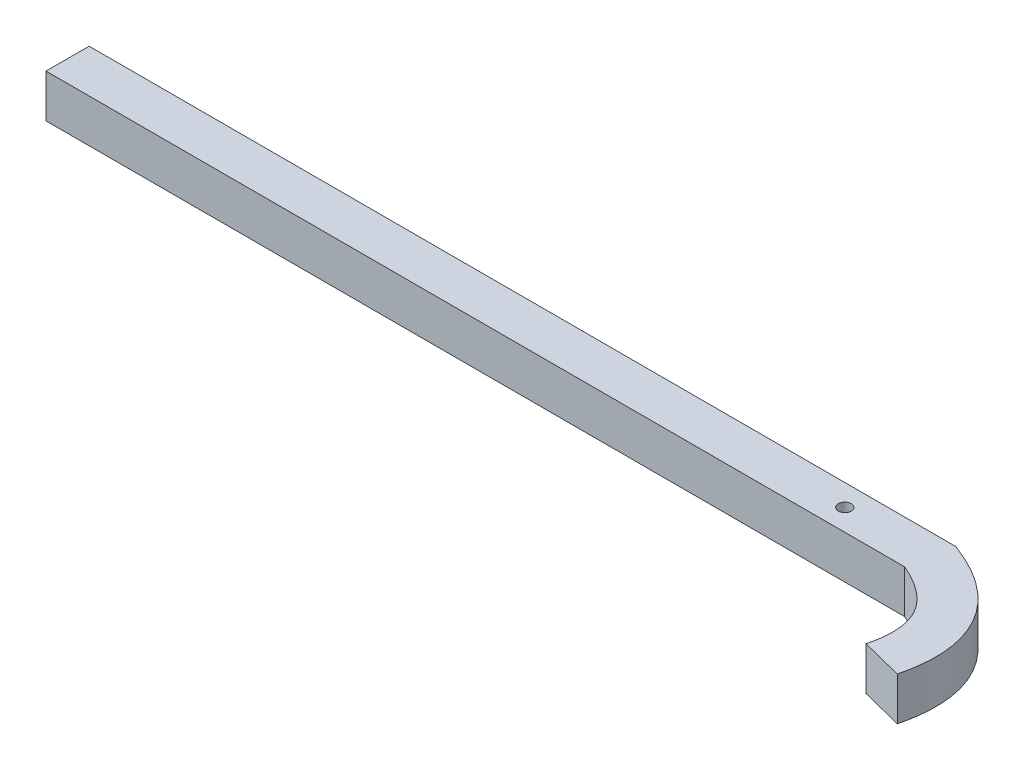
ISO-10303-21;
HEADER;
FILE_DESCRIPTION(('STEP AP214'),'2;1');
FILE_NAME('part.step','',(''),(''),'','','');
FILE_SCHEMA(('AUTOMOTIVE_DESIGN { 1 0 10303 214 1 1 1 1 }'));
ENDSEC;
DATA;
#1=APPLICATION_CONTEXT('core data for automotive mechanical design processes');
#2=APPLICATION_PROTOCOL_DEFINITION('international standard','automotive_design',2000,#1);
#3=PRODUCT_CONTEXT('',#1,'mechanical');
#4=PRODUCT('Part','Part','',(#3));
#5=PRODUCT_RELATED_PRODUCT_CATEGORY('part','',(#4));
#6=PRODUCT_DEFINITION_FORMATION('','',#4);
#7=PRODUCT_DEFINITION_CONTEXT('part definition',#1,'design');
#8=PRODUCT_DEFINITION('design','',#6,#7);
#9=PRODUCT_DEFINITION_SHAPE('','',#8);
#10=(LENGTH_UNIT() NAMED_UNIT(*) SI_UNIT(.MILLI.,.METRE.));
#11=(NAMED_UNIT(*) PLANE_ANGLE_UNIT() SI_UNIT($,.RADIAN.));
#12=(NAMED_UNIT(*) SI_UNIT($,.STERADIAN.) SOLID_ANGLE_UNIT());
#13=UNCERTAINTY_MEASURE_WITH_UNIT(LENGTH_MEASURE(1.E-05),#10,'distance_accuracy_value','');
#14=(GEOMETRIC_REPRESENTATION_CONTEXT(3) GLOBAL_UNCERTAINTY_ASSIGNED_CONTEXT((#13)) GLOBAL_UNIT_ASSIGNED_CONTEXT((#10,
#11,#12)) REPRESENTATION_CONTEXT('',''));
#15=CARTESIAN_POINT('',(0.,0.,0.));
#16=DIRECTION('',(0.,0.,1.));
#17=DIRECTION('',(1.,0.,0.));
#18=AXIS2_PLACEMENT_3D('',#15,#16,#17);
#19=CARTESIAN_POINT('',(177.902591858149,10.,-10.));
#20=DIRECTION('',(0.,-1.,0.));
#21=DIRECTION('',(0.,0.,-1.));
#22=AXIS2_PLACEMENT_3D('',#19,#20,#21);
#23=PLANE('',#22);
#24=CARTESIAN_POINT('',(110.,10.,0.));
#25=DIRECTION('',(0.,1.,0.));
#26=DIRECTION('',(0.,0.,1.));
#27=AXIS2_PLACEMENT_3D('',#24,#25,#26);
#28=CIRCLE('',#27,3.00000000000001);
#29=CARTESIAN_POINT('',(110.,10.,3.00000000000001));
#30=VERTEX_POINT('',#29);
#31=EDGE_CURVE('E144',#30,#30,#28,.T.);
#32=ORIENTED_EDGE('',*,*,#31,.F.);
#33=EDGE_LOOP('',(#32));
#34=FACE_BOUND('',#33,.T.);
#35=DIRECTION('',(-1.,0.,0.));
#36=VECTOR('',#35,1.);
#37=CARTESIAN_POINT('',(177.902591858149,10.,10.));
#38=LINE('',#37,#36);
#39=CARTESIAN_POINT('',(147.713708848856,10.,10.));
#40=VERTEX_POINT('',#39);
#41=CARTESIAN_POINT('',(-250.381679389313,10.,10.));
#42=VERTEX_POINT('',#41);
#43=EDGE_CURVE('E210',#40,#42,#38,.T.);
#44=ORIENTED_EDGE('',*,*,#43,.F.);
#45=CARTESIAN_POINT('',(147.713708848856,10.,9.99999999999999));
#46=CARTESIAN_POINT('',(150.081363110265,10.,10.9358404741904));
#47=CARTESIAN_POINT('',(154.528980952823,10.,13.1788147449034));
#48=CARTESIAN_POINT('',(160.089294206417,10.,16.7889735365902));
#49=CARTESIAN_POINT('',(164.357345810155,10.,20.6459259482876));
#50=CARTESIAN_POINT('',(167.432438964962,10.,24.6123384166422));
#51=CARTESIAN_POINT('',(169.508960938775,10.,28.7079400858626));
#52=CARTESIAN_POINT('',(170.78049703697,10.,33.0844068776301));
#53=CARTESIAN_POINT('',(171.308914135224,10.,37.9957200930307));
#54=CARTESIAN_POINT('',(171.02871454986,10.,43.5843950988019));
#55=CARTESIAN_POINT('',(170.221323046046,10.,47.7546976190972));
#56=CARTESIAN_POINT('',(169.694372092045,10.,49.8389294134533));
#57=B_SPLINE_CURVE_WITH_KNOTS('',3,(#45,#46,#47,#48,#49,#50,#51,#52,#53,#54,#55,#56),
.UNSPECIFIED.,.F.,.F.,(4,1,1,1,1,1,1,1,1,4),(0.,0.132599857350981,0.253471230054705,
0.364788666069843,0.469300478006779,0.570281662936163,0.669514853226326,0.772223870651777,
0.881514942063959,1.),.UNSPECIFIED.);
#58=CARTESIAN_POINT('',(169.694372092045,10.,49.8389294134533));
#59=VERTEX_POINT('',#58);
#60=EDGE_CURVE('E177',#40,#59,#57,.T.);
#61=ORIENTED_EDGE('',*,*,#60,.T.);
#62=DIRECTION('',(-0.969494088505385,0.,-0.245114692242454));
#63=VECTOR('',#62,1.);
#64=CARTESIAN_POINT('',(179.389312977099,10.,52.2900763358779));
#65=LINE('',#64,#63);
#66=CARTESIAN_POINT('',(189.084253862153,10.,54.7412232583024));
#67=VERTEX_POINT('',#66);
#68=EDGE_CURVE('E185',#67,#59,#65,.T.);
#69=ORIENTED_EDGE('',*,*,#68,.F.);
#70=CARTESIAN_POINT('',(151.522932372518,10.,-10.));
#71=CARTESIAN_POINT('',(154.712223150804,10.,-8.73939897267547));
#72=CARTESIAN_POINT('',(160.708606990489,10.,-6.27013356306773));
#73=CARTESIAN_POINT('',(169.189391199744,10.,-1.35745716318533));
#74=CARTESIAN_POINT('',(176.563581045502,9.99999999999999,4.44084880327522));
#75=CARTESIAN_POINT('',(182.693323150686,9.99999999999999,11.2788765251708));
#76=CARTESIAN_POINT('',(187.299514853687,10.,19.0654259630927));
#77=CARTESIAN_POINT('',(190.201744816442,10.,27.5790198884068));
#78=CARTESIAN_POINT('',(191.39483682233,10.,36.5084467679523));
#79=CARTESIAN_POINT('',(190.998421352275,10.,45.7445437476372));
#80=CARTESIAN_POINT('',(189.861567362946,10.,51.666740708767));
#81=CARTESIAN_POINT('',(189.084253862153,10.,54.7412232583024));
#82=B_SPLINE_CURVE_WITH_KNOTS('',3,(#70,#71,#72,#73,#74,#75,#76,#77,#78,#79,#80,#81),
.UNSPECIFIED.,.F.,.F.,(4,1,1,1,1,1,1,1,1,4),(0.,0.132599857350981,0.253471230054705,
0.364788666069843,0.469300478006779,0.570281662936163,0.669514853226326,0.772223870651777,
0.881514942063959,1.),.UNSPECIFIED.);
#83=CARTESIAN_POINT('',(151.522932372518,10.,-10.));
#84=VERTEX_POINT('',#83);
#85=EDGE_CURVE('E154',#84,#67,#82,.T.);
#86=ORIENTED_EDGE('',*,*,#85,.F.);
#87=DIRECTION('',(-1.,0.,0.));
#88=VECTOR('',#87,1.);
#89=CARTESIAN_POINT('',(177.902591858149,10.,-10.));
#90=LINE('',#89,#88);
#91=CARTESIAN_POINT('',(-250.381679389313,10.,-10.));
#92=VERTEX_POINT('',#91);
#93=EDGE_CURVE('E212',#84,#92,#90,.T.);
#94=ORIENTED_EDGE('',*,*,#93,.T.);
#95=DIRECTION('',(0.,0.,1.));
#96=VECTOR('',#95,1.);
#97=CARTESIAN_POINT('',(-250.381679389313,10.,-10.));
#98=LINE('',#97,#96);
#99=EDGE_CURVE('E207',#92,#42,#98,.T.);
#100=ORIENTED_EDGE('',*,*,#99,.T.);
#101=EDGE_LOOP('',(#44,#61,#69,#86,#94,#100));
#102=FACE_BOUND('',#101,.T.);
#103=ADVANCED_FACE('F33',(#34,#102),#23,.F.);
#104=CARTESIAN_POINT('',(177.902591858149,10.,-10.));
#105=DIRECTION('',(0.,0.,1.));
#106=DIRECTION('',(1.,0.,0.));
#107=AXIS2_PLACEMENT_3D('',#104,#105,#106);
#108=PLANE('',#107);
#109=DIRECTION('',(1.,0.,0.));
#110=VECTOR('',#109,1.);
#111=CARTESIAN_POINT('',(0.,4.25,-10.));
#112=LINE('',#111,#110);
#113=CARTESIAN_POINT('',(-245.420808417911,4.25,-10.));
#114=VERTEX_POINT('',#113);
#115=CARTESIAN_POINT('',(0.,4.25,-10.));
#116=VERTEX_POINT('',#115);
#117=EDGE_CURVE('E138',#114,#116,#112,.T.);
#118=ORIENTED_EDGE('',*,*,#117,.F.);
#119=DIRECTION('',(0.,1.,0.));
#120=VECTOR('',#119,1.);
#121=CARTESIAN_POINT('',(-245.420808417911,4.25,-10.));
#122=LINE('',#121,#120);
#123=CARTESIAN_POINT('',(-245.420808417911,-4.25,-10.));
#124=VERTEX_POINT('',#123);
#125=EDGE_CURVE('E48',#124,#114,#122,.T.);
#126=ORIENTED_EDGE('',*,*,#125,.F.);
#127=DIRECTION('',(-1.,0.,0.));
#128=VECTOR('',#127,1.);
#129=CARTESIAN_POINT('',(0.,-4.25,-10.));
#130=LINE('',#129,#128);
#131=CARTESIAN_POINT('',(0.,-4.25,-10.));
#132=VERTEX_POINT('',#131);
#133=EDGE_CURVE('E129',#132,#124,#130,.T.);
#134=ORIENTED_EDGE('',*,*,#133,.F.);
#135=DIRECTION('',(0.,-1.,0.));
#136=VECTOR('',#135,1.);
#137=CARTESIAN_POINT('',(0.,4.25,-10.));
#138=LINE('',#137,#136);
#139=EDGE_CURVE('E132',#116,#132,#138,.T.);
#140=ORIENTED_EDGE('',*,*,#139,.F.);
#141=EDGE_LOOP('',(#118,#126,#134,#140));
#142=FACE_BOUND('',#141,.T.);
#143=DIRECTION('',(0.,1.,0.));
#144=VECTOR('',#143,1.);
#145=CARTESIAN_POINT('',(151.522932372518,10.,-10.));
#146=LINE('',#145,#144);
#147=CARTESIAN_POINT('',(151.522932372518,-10.,-10.));
#148=VERTEX_POINT('',#147);
#149=EDGE_CURVE('E41',#148,#84,#146,.T.);
#150=ORIENTED_EDGE('',*,*,#149,.F.);
#151=DIRECTION('',(-1.,0.,0.));
#152=VECTOR('',#151,1.);
#153=CARTESIAN_POINT('',(177.902591858149,-10.,-10.));
#154=LINE('',#153,#152);
#155=CARTESIAN_POINT('',(-250.381679389313,-10.,-10.));
#156=VERTEX_POINT('',#155);
#157=EDGE_CURVE('E214',#148,#156,#154,.T.);
#158=ORIENTED_EDGE('',*,*,#157,.T.);
#159=DIRECTION('',(0.,1.,0.));
#160=VECTOR('',#159,1.);
#161=CARTESIAN_POINT('',(-250.381679389313,10.,-10.));
#162=LINE('',#161,#160);
#163=EDGE_CURVE('E204',#156,#92,#162,.T.);
#164=ORIENTED_EDGE('',*,*,#163,.T.);
#165=ORIENTED_EDGE('',*,*,#93,.F.);
#166=EDGE_LOOP('',(#150,#158,#164,#165));
#167=FACE_BOUND('',#166,.T.);
#168=ADVANCED_FACE('F230',(#142,#167),#108,.F.);
#169=CARTESIAN_POINT('',(177.902591858149,-10.,-10.));
#170=DIRECTION('',(0.,1.,0.));
#171=DIRECTION('',(0.,0.,1.));
#172=AXIS2_PLACEMENT_3D('',#169,#170,#171);
#173=PLANE('',#172);
#174=CARTESIAN_POINT('',(110.,-10.,0.));
#175=DIRECTION('',(0.,1.,0.));
#176=DIRECTION('',(0.,0.,1.));
#177=AXIS2_PLACEMENT_3D('',#174,#175,#176);
#178=CIRCLE('',#177,3.00000000000001);
#179=CARTESIAN_POINT('',(110.,-10.,3.00000000000001));
#180=VERTEX_POINT('',#179);
#181=EDGE_CURVE('E148',#180,#180,#178,.T.);
#182=ORIENTED_EDGE('',*,*,#181,.T.);
#183=EDGE_LOOP('',(#182));
#184=FACE_BOUND('',#183,.T.);
#185=ORIENTED_EDGE('',*,*,#157,.F.);
#186=CARTESIAN_POINT('',(151.522932372518,-9.99999999999999,-9.99999999999999));
#187=CARTESIAN_POINT('',(154.712223150804,-9.99999999999999,-8.73939897267545));
#188=CARTESIAN_POINT('',(160.708606990489,-9.99999999999999,-6.27013356306771));
#189=CARTESIAN_POINT('',(169.189391199744,-9.99999999999999,-1.35745716318532));
#190=CARTESIAN_POINT('',(176.563581045502,-10.,4.44084880327525));
#191=CARTESIAN_POINT('',(182.693323150686,-9.99999999999999,11.2788765251708));
#192=CARTESIAN_POINT('',(187.299514853687,-10.,19.0654259630927));
#193=CARTESIAN_POINT('',(190.201744816442,-10.,27.5790198884068));
#194=CARTESIAN_POINT('',(191.39483682233,-9.99999999999999,36.5084467679523));
#195=CARTESIAN_POINT('',(190.998421352275,-10.,45.7445437476372));
#196=CARTESIAN_POINT('',(189.861567362946,-9.99999999999999,51.666740708767));
#197=CARTESIAN_POINT('',(189.084253862153,-9.99999999999999,54.7412232583024));
#198=B_SPLINE_CURVE_WITH_KNOTS('',3,(#186,#187,#188,#189,#190,#191,#192,#193,#194,#195,#196,
#197),.UNSPECIFIED.,.F.,.F.,(4,1,1,1,1,1,1,1,1,4),(0.,0.132599857350981,0.253471230054705,
0.364788666069843,0.469300478006779,0.570281662936163,0.669514853226326,0.772223870651777,
0.881514942063959,1.),.UNSPECIFIED.);
#199=CARTESIAN_POINT('',(189.084253862153,-9.99999999999999,54.7412232583024));
#200=VERTEX_POINT('',#199);
#201=EDGE_CURVE('E159',#148,#200,#198,.T.);
#202=ORIENTED_EDGE('',*,*,#201,.T.);
#203=DIRECTION('',(0.969494088505385,0.,0.245114692242452));
#204=VECTOR('',#203,1.);
#205=CARTESIAN_POINT('',(179.389312977099,-9.99999999999999,52.2900763358778));
#206=LINE('',#205,#204);
#207=CARTESIAN_POINT('',(169.694372092045,-10.,49.8389294134533));
#208=VERTEX_POINT('',#207);
#209=EDGE_CURVE('E167',#208,#200,#206,.T.);
#210=ORIENTED_EDGE('',*,*,#209,.F.);
#211=CARTESIAN_POINT('',(147.713708848856,-10.,10.));
#212=CARTESIAN_POINT('',(150.081363110265,-10.,10.9358404741904));
#213=CARTESIAN_POINT('',(154.528980952823,-10.,13.1788147449035));
#214=CARTESIAN_POINT('',(160.089294206417,-10.,16.7889735365902));
#215=CARTESIAN_POINT('',(164.357345810155,-9.99999999999999,20.6459259482876));
#216=CARTESIAN_POINT('',(167.432438964962,-9.99999999999999,24.6123384166423));
#217=CARTESIAN_POINT('',(169.508960938775,-10.,28.7079400858626));
#218=CARTESIAN_POINT('',(170.78049703697,-10.,33.0844068776301));
#219=CARTESIAN_POINT('',(171.308914135224,-10.,37.9957200930307));
#220=CARTESIAN_POINT('',(171.02871454986,-10.,43.5843950988018));
#221=CARTESIAN_POINT('',(170.221323046046,-10.,47.7546976190972));
#222=CARTESIAN_POINT('',(169.694372092045,-10.,49.8389294134533));
#223=B_SPLINE_CURVE_WITH_KNOTS('',3,(#211,#212,#213,#214,#215,#216,#217,#218,#219,#220,#221,
#222),.UNSPECIFIED.,.F.,.F.,(4,1,1,1,1,1,1,1,1,4),(0.,0.132599857350981,0.253471230054705,
0.364788666069843,0.469300478006779,0.570281662936163,0.669514853226326,0.772223870651777,
0.881514942063959,1.),.UNSPECIFIED.);
#224=CARTESIAN_POINT('',(147.713708848856,-10.,10.));
#225=VERTEX_POINT('',#224);
#226=EDGE_CURVE('E168',#225,#208,#223,.T.);
#227=ORIENTED_EDGE('',*,*,#226,.F.);
#228=DIRECTION('',(-1.,0.,0.));
#229=VECTOR('',#228,1.);
#230=CARTESIAN_POINT('',(177.902591858149,-10.,10.));
#231=LINE('',#230,#229);
#232=CARTESIAN_POINT('',(-250.381679389313,-10.,10.));
#233=VERTEX_POINT('',#232);
#234=EDGE_CURVE('E198',#225,#233,#231,.T.);
#235=ORIENTED_EDGE('',*,*,#234,.T.);
#236=DIRECTION('',(0.,0.,-1.));
#237=VECTOR('',#236,1.);
#238=CARTESIAN_POINT('',(-250.381679389313,-10.,-10.));
#239=LINE('',#238,#237);
#240=EDGE_CURVE('E201',#233,#156,#239,.T.);
#241=ORIENTED_EDGE('',*,*,#240,.T.);
#242=EDGE_LOOP('',(#185,#202,#210,#227,#235,#241));
#243=FACE_BOUND('',#242,.T.);
#244=ADVANCED_FACE('F218',(#184,#243),#173,.F.);
#245=CARTESIAN_POINT('',(177.902591858149,10.,10.));
#246=DIRECTION('',(0.,0.,-1.));
#247=DIRECTION('',(0.,1.,0.));
#248=AXIS2_PLACEMENT_3D('',#245,#246,#247);
#249=PLANE('',#248);
#250=DIRECTION('',(0.,-1.,0.));
#251=VECTOR('',#250,1.);
#252=CARTESIAN_POINT('',(147.713708848856,10.,10.));
#253=LINE('',#252,#251);
#254=EDGE_CURVE('E11',#40,#225,#253,.T.);
#255=ORIENTED_EDGE('',*,*,#254,.F.);
#256=ORIENTED_EDGE('',*,*,#43,.T.);
#257=DIRECTION('',(0.,-1.,0.));
#258=VECTOR('',#257,1.);
#259=CARTESIAN_POINT('',(-250.381679389313,10.,10.));
#260=LINE('',#259,#258);
#261=EDGE_CURVE('E191',#42,#233,#260,.T.);
#262=ORIENTED_EDGE('',*,*,#261,.T.);
#263=ORIENTED_EDGE('',*,*,#234,.F.);
#264=EDGE_LOOP('',(#255,#256,#262,#263));
#265=FACE_BOUND('',#264,.T.);
#266=ADVANCED_FACE('F35',(#265),#249,.F.);
#267=CARTESIAN_POINT('',(-250.381679389313,0.,0.));
#268=DIRECTION('',(-1.,0.,0.));
#269=DIRECTION('',(0.,0.,1.));
#270=AXIS2_PLACEMENT_3D('',#267,#268,#269);
#271=PLANE('',#270);
#272=ORIENTED_EDGE('',*,*,#261,.F.);
#273=ORIENTED_EDGE('',*,*,#99,.F.);
#274=ORIENTED_EDGE('',*,*,#163,.F.);
#275=ORIENTED_EDGE('',*,*,#240,.F.);
#276=EDGE_LOOP('',(#272,#273,#274,#275));
#277=FACE_BOUND('',#276,.T.);
#278=ADVANCED_FACE('F224',(#277),#271,.T.);
#279=CARTESIAN_POINT('',(179.389312977099,10.,52.2900763358779));
#280=DIRECTION('',(0.245114692242454,0.,-0.969494088505385));
#281=DIRECTION('',(-0.969494088505385,0.,-0.245114692242454));
#282=AXIS2_PLACEMENT_3D('',#279,#280,#281);
#283=PLANE('',#282);
#284=ORIENTED_EDGE('',*,*,#68,.T.);
#285=DIRECTION('',(0.,-1.,0.));
#286=VECTOR('',#285,1.);
#287=CARTESIAN_POINT('',(169.694372092045,0.,49.8389294134533));
#288=LINE('',#287,#286);
#289=EDGE_CURVE('E176',#59,#208,#288,.T.);
#290=ORIENTED_EDGE('',*,*,#289,.T.);
#291=ORIENTED_EDGE('',*,*,#209,.T.);
#292=DIRECTION('',(0.,1.,0.));
#293=VECTOR('',#292,1.);
#294=CARTESIAN_POINT('',(189.084253862153,0.,54.7412232583024));
#295=LINE('',#294,#293);
#296=EDGE_CURVE('E151',#200,#67,#295,.T.);
#297=ORIENTED_EDGE('',*,*,#296,.T.);
#298=EDGE_LOOP('',(#284,#290,#291,#297));
#299=FACE_BOUND('',#298,.T.);
#300=ADVANCED_FACE('F235',(#299),#283,.F.);
#301=CARTESIAN_POINT('',(147.713708848856,10.,9.99999999999999));
#302=CARTESIAN_POINT('',(150.081363110265,10.,10.9358404741904));
#303=CARTESIAN_POINT('',(154.528980952823,10.,13.1788147449034));
#304=CARTESIAN_POINT('',(160.089294206417,10.,16.7889735365902));
#305=CARTESIAN_POINT('',(164.357345810155,10.,20.6459259482876));
#306=CARTESIAN_POINT('',(167.432438964962,10.,24.6123384166422));
#307=CARTESIAN_POINT('',(169.508960938775,10.,28.7079400858626));
#308=CARTESIAN_POINT('',(170.78049703697,10.,33.0844068776301));
#309=CARTESIAN_POINT('',(171.308914135224,10.,37.9957200930307));
#310=CARTESIAN_POINT('',(171.02871454986,10.,43.5843950988019));
#311=CARTESIAN_POINT('',(170.221323046046,10.,47.7546976190972));
#312=CARTESIAN_POINT('',(169.694372092045,10.,49.8389294134533));
#313=CARTESIAN_POINT('',(147.713708848856,3.33333333333333,10.));
#314=CARTESIAN_POINT('',(149.909436979569,3.33333333333333,10.8678848464203));
#315=CARTESIAN_POINT('',(154.601688172113,3.33333333333333,13.2075657940756));
#316=CARTESIAN_POINT('',(160.072193733132,3.33333333333333,16.7821753434263));
#317=CARTESIAN_POINT('',(164.361444153705,3.33333333333335,20.6476752175819));
#318=CARTESIAN_POINT('',(167.431504693336,3.33333333333334,24.6115243787849));
#319=CARTESIAN_POINT('',(169.50886365035,3.33333333333334,28.709491097975));
#320=CARTESIAN_POINT('',(170.781781864086,3.33333333333334,33.0790033440261));
#321=CARTESIAN_POINT('',(171.303519645476,3.33333333333334,38.0171506314902));
#322=CARTESIAN_POINT('',(171.051117307955,3.33333333333334,43.4957561857528));
#323=CARTESIAN_POINT('',(170.168935082442,3.33333333333333,47.9619060102289));
#324=CARTESIAN_POINT('',(169.694372092045,3.33333333333333,49.8389294134533));
#325=CARTESIAN_POINT('',(147.713708848856,-3.33333333333334,10.));
#326=CARTESIAN_POINT('',(149.880612959326,-3.33333333333334,10.8564918465167));
#327=CARTESIAN_POINT('',(154.61387779304,-3.33333333333334,13.2123860085478));
#328=CARTESIAN_POINT('',(160.069326778666,-3.33333333333333,16.7810356024423));
#329=CARTESIAN_POINT('',(164.36213125541,-3.33333333333332,20.6479684887289));
#330=CARTESIAN_POINT('',(167.431348059413,-3.33333333333333,24.6113879024762));
#331=CARTESIAN_POINT('',(169.508847339604,-3.33333333333333,28.7097511306085));
#332=CARTESIAN_POINT('',(170.781997269868,-3.33333333333333,33.0780974226205));
#333=CARTESIAN_POINT('',(171.302615240304,-3.33333333333333,38.0207435366052));
#334=CARTESIAN_POINT('',(171.05487320911,-3.33333333333333,43.4808955603571));
#335=CARTESIAN_POINT('',(170.160152056167,-3.33333333333333,47.9966452254735));
#336=CARTESIAN_POINT('',(169.694372092045,-3.33333333333333,49.8389294134533));
#337=CARTESIAN_POINT('',(147.713708848856,-10.,10.));
#338=CARTESIAN_POINT('',(150.081363110265,-10.,10.9358404741904));
#339=CARTESIAN_POINT('',(154.528980952823,-10.,13.1788147449035));
#340=CARTESIAN_POINT('',(160.089294206417,-10.,16.7889735365902));
#341=CARTESIAN_POINT('',(164.357345810155,-9.99999999999999,20.6459259482876));
#342=CARTESIAN_POINT('',(167.432438964962,-9.99999999999999,24.6123384166423));
#343=CARTESIAN_POINT('',(169.508960938775,-10.,28.7079400858626));
#344=CARTESIAN_POINT('',(170.78049703697,-10.,33.0844068776301));
#345=CARTESIAN_POINT('',(171.308914135224,-10.,37.9957200930307));
#346=CARTESIAN_POINT('',(171.02871454986,-10.,43.5843950988018));
#347=CARTESIAN_POINT('',(170.221323046046,-10.,47.7546976190972));
#348=CARTESIAN_POINT('',(169.694372092045,-10.,49.8389294134533));
#349=B_SPLINE_SURFACE_WITH_KNOTS('',3,3,((#301,#302,#303,#304,#305,#306,#307,#308,#309,#310,
#311,#312),(#313,#314,#315,#316,#317,#318,#319,#320,#321,#322,#323,#324),(#325,#326,#327,#328,
#329,#330,#331,#332,#333,#334,#335,#336),(#337,#338,#339,#340,#341,#342,#343,#344,#345,#346,
#347,#348)),.UNSPECIFIED.,.F.,.F.,.F.,(4,4),(4,1,1,1,1,1,1,1,1,4),(0.252227003351707,0.5),(0.,
0.132599857350981,0.253471230054705,0.364788666069843,0.469300478006779,0.570281662936163,
0.669514853226326,0.772223870651777,0.881514942063959,1.),.UNSPECIFIED.);
#350=ORIENTED_EDGE('',*,*,#254,.T.);
#351=ORIENTED_EDGE('',*,*,#226,.T.);
#352=ORIENTED_EDGE('',*,*,#289,.F.);
#353=ORIENTED_EDGE('',*,*,#60,.F.);
#354=EDGE_LOOP('',(#350,#351,#352,#353));
#355=FACE_BOUND('',#354,.T.);
#356=ADVANCED_FACE('F237',(#355),#349,.T.);
#357=CARTESIAN_POINT('',(151.522932372518,-9.99999999999999,-9.99999999999999));
#358=CARTESIAN_POINT('',(154.712223150804,-9.99999999999999,-8.73939897267545));
#359=CARTESIAN_POINT('',(160.708606990489,-9.99999999999999,-6.27013356306771));
#360=CARTESIAN_POINT('',(169.189391199744,-9.99999999999999,-1.35745716318532));
#361=CARTESIAN_POINT('',(176.563581045502,-10.,4.44084880327525));
#362=CARTESIAN_POINT('',(182.693323150686,-9.99999999999999,11.2788765251708));
#363=CARTESIAN_POINT('',(187.299514853687,-10.,19.0654259630927));
#364=CARTESIAN_POINT('',(190.201744816442,-10.,27.5790198884068));
#365=CARTESIAN_POINT('',(191.39483682233,-9.99999999999999,36.5084467679523));
#366=CARTESIAN_POINT('',(190.998421352275,-10.,45.7445437476372));
#367=CARTESIAN_POINT('',(189.861567362946,-9.99999999999999,51.666740708767));
#368=CARTESIAN_POINT('',(189.084253862153,-9.99999999999999,54.7412232583024));
#369=CARTESIAN_POINT('',(151.522932372518,-3.33333333333333,-9.99999999999999));
#370=CARTESIAN_POINT('',(154.8841492815,-3.33333333333333,-8.67144334490539));
#371=CARTESIAN_POINT('',(160.635899771199,-3.33333333333332,-6.29888461223983));
#372=CARTESIAN_POINT('',(169.20649167303,-3.33333333333333,-1.35065897002141));
#373=CARTESIAN_POINT('',(176.559482701952,-3.33333333333334,4.43909953398096));
#374=CARTESIAN_POINT('',(182.694257422312,-3.33333333333333,11.2796905630282));
#375=CARTESIAN_POINT('',(187.299612142112,-3.33333333333334,19.0638749509803));
#376=CARTESIAN_POINT('',(190.200459989326,-3.33333333333333,27.5844234220108));
#377=CARTESIAN_POINT('',(191.400231312078,-3.33333333333333,36.4870162294928));
#378=CARTESIAN_POINT('',(190.97601859418,-3.33333333333333,45.8331826606862));
#379=CARTESIAN_POINT('',(189.913955326549,-3.33333333333333,51.4595323176352));
#380=CARTESIAN_POINT('',(189.084253862153,-3.33333333333333,54.7412232583024));
#381=CARTESIAN_POINT('',(151.522932372518,3.33333333333334,-9.99999999999999));
#382=CARTESIAN_POINT('',(154.798186216152,3.33333333333334,-8.70542115879042));
#383=CARTESIAN_POINT('',(160.672253380844,3.33333333333334,-6.28450908765377));
#384=CARTESIAN_POINT('',(169.197941436387,3.33333333333334,-1.35405806660337));
#385=CARTESIAN_POINT('',(176.561531873727,3.33333333333333,4.43997416862811));
#386=CARTESIAN_POINT('',(182.693790286499,3.33333333333333,11.2792835440995));
#387=CARTESIAN_POINT('',(187.2995634979,3.33333333333333,19.0646504570365));
#388=CARTESIAN_POINT('',(190.201102402884,3.33333333333333,27.5817216552088));
#389=CARTESIAN_POINT('',(191.397534067204,3.33333333333333,36.4977314987226));
#390=CARTESIAN_POINT('',(190.987219973228,3.33333333333333,45.7888632041617));
#391=CARTESIAN_POINT('',(189.887761344748,3.33333333333334,51.5631365132011));
#392=CARTESIAN_POINT('',(189.084253862153,3.33333333333334,54.7412232583024));
#393=CARTESIAN_POINT('',(151.522932372518,10.,-9.99999999999999));
#394=CARTESIAN_POINT('',(154.712223150804,10.,-8.73939897267545));
#395=CARTESIAN_POINT('',(160.708606990489,10.,-6.27013356306771));
#396=CARTESIAN_POINT('',(169.189391199744,10.,-1.35745716318532));
#397=CARTESIAN_POINT('',(176.563581045502,9.99999999999999,4.44084880327526));
#398=CARTESIAN_POINT('',(182.693323150686,9.99999999999999,11.2788765251708));
#399=CARTESIAN_POINT('',(187.299514853687,10.,19.0654259630927));
#400=CARTESIAN_POINT('',(190.201744816442,10.,27.5790198884068));
#401=CARTESIAN_POINT('',(191.39483682233,10.,36.5084467679523));
#402=CARTESIAN_POINT('',(190.998421352275,10.,45.7445437476372));
#403=CARTESIAN_POINT('',(189.861567362946,10.,51.666740708767));
#404=CARTESIAN_POINT('',(189.084253862153,10.,54.7412232583024));
#405=B_SPLINE_SURFACE_WITH_KNOTS('',3,3,((#357,#358,#359,#360,#361,#362,#363,#364,#365,#366,
#367,#368),(#369,#370,#371,#372,#373,#374,#375,#376,#377,#378,#379,#380),(#381,#382,#383,#384,
#385,#386,#387,#388,#389,#390,#391,#392),(#393,#394,#395,#396,#397,#398,#399,#400,#401,#402,
#403,#404)),.UNSPECIFIED.,.F.,.F.,.F.,(4,4),(4,1,1,1,1,1,1,1,1,4),(0.752227003351707,1.),(0.,
0.132599857350981,0.253471230054705,0.364788666069843,0.469300478006779,0.570281662936163,
0.669514853226326,0.772223870651777,0.881514942063959,1.),.UNSPECIFIED.);
#406=ORIENTED_EDGE('',*,*,#149,.T.);
#407=ORIENTED_EDGE('',*,*,#85,.T.);
#408=ORIENTED_EDGE('',*,*,#296,.F.);
#409=ORIENTED_EDGE('',*,*,#201,.F.);
#410=EDGE_LOOP('',(#406,#407,#408,#409));
#411=FACE_BOUND('',#410,.T.);
#412=ADVANCED_FACE('F233',(#411),#405,.T.);
#413=CARTESIAN_POINT('',(110.,-10.,0.));
#414=DIRECTION('',(0.,1.,0.));
#415=DIRECTION('',(0.,0.,1.));
#416=AXIS2_PLACEMENT_3D('',#413,#414,#415);
#417=CYLINDRICAL_SURFACE('',#416,3.00000000000001);
#418=CARTESIAN_POINT('',(110.,-10.,3.00000000000001));
#419=CARTESIAN_POINT('',(110.,-9.79166666666667,3.00000000000001));
#420=CARTESIAN_POINT('',(110.,-9.58333333333334,3.00000000000001));
#421=CARTESIAN_POINT('',(110.,-9.16666666666667,3.00000000000001));
#422=CARTESIAN_POINT('',(110.,-8.95833333333334,3.00000000000001));
#423=CARTESIAN_POINT('',(110.,-8.54166666666667,3.00000000000001));
#424=CARTESIAN_POINT('',(110.,-8.33333333333334,3.00000000000001));
#425=CARTESIAN_POINT('',(110.,-7.91666666666667,3.00000000000001));
#426=CARTESIAN_POINT('',(110.,-7.70833333333334,3.00000000000001));
#427=CARTESIAN_POINT('',(110.,-7.29166666666667,3.00000000000001));
#428=CARTESIAN_POINT('',(110.,-7.08333333333334,3.00000000000001));
#429=CARTESIAN_POINT('',(110.,-6.66666666666667,3.00000000000001));
#430=CARTESIAN_POINT('',(110.,-6.45833333333334,3.00000000000001));
#431=CARTESIAN_POINT('',(110.,-6.04166666666667,3.00000000000001));
#432=CARTESIAN_POINT('',(110.,-5.83333333333334,3.00000000000001));
#433=CARTESIAN_POINT('',(110.,-5.41666666666667,3.00000000000001));
#434=CARTESIAN_POINT('',(110.,-5.20833333333334,3.00000000000001));
#435=CARTESIAN_POINT('',(110.,-4.79166666666667,3.00000000000001));
#436=CARTESIAN_POINT('',(110.,-4.58333333333334,3.00000000000001));
#437=CARTESIAN_POINT('',(110.,-4.16666666666667,3.00000000000001));
#438=CARTESIAN_POINT('',(110.,-3.95833333333334,3.00000000000001));
#439=CARTESIAN_POINT('',(110.,-3.54166666666667,3.00000000000001));
#440=CARTESIAN_POINT('',(110.,-3.33333333333334,3.00000000000001));
#441=CARTESIAN_POINT('',(110.,-2.91666666666667,3.00000000000001));
#442=CARTESIAN_POINT('',(110.,-2.70833333333334,3.00000000000001));
#443=CARTESIAN_POINT('',(110.,-2.29166666666667,3.00000000000001));
#444=CARTESIAN_POINT('',(110.,-2.08333333333334,3.00000000000001));
#445=CARTESIAN_POINT('',(110.,-1.66666666666667,3.00000000000001));
#446=CARTESIAN_POINT('',(110.,-1.45833333333334,3.00000000000001));
#447=CARTESIAN_POINT('',(110.,-1.04166666666667,3.00000000000001));
#448=CARTESIAN_POINT('',(110.,-0.833333333333337,3.00000000000001));
#449=CARTESIAN_POINT('',(110.,-0.416666666666671,3.00000000000001));
#450=CARTESIAN_POINT('',(110.,-0.208333333333337,3.00000000000001));
#451=CARTESIAN_POINT('',(110.,0.20833333333333,3.00000000000001));
#452=CARTESIAN_POINT('',(110.,0.416666666666664,3.00000000000001));
#453=CARTESIAN_POINT('',(110.,0.833333333333331,3.00000000000001));
#454=CARTESIAN_POINT('',(110.,1.04166666666666,3.00000000000001));
#455=CARTESIAN_POINT('',(110.,1.45833333333333,3.00000000000001));
#456=CARTESIAN_POINT('',(110.,1.66666666666666,3.00000000000001));
#457=CARTESIAN_POINT('',(110.,2.08333333333333,3.00000000000001));
#458=CARTESIAN_POINT('',(110.,2.29166666666667,3.00000000000001));
#459=CARTESIAN_POINT('',(110.,2.70833333333333,3.00000000000001));
#460=CARTESIAN_POINT('',(110.,2.91666666666666,3.00000000000001));
#461=CARTESIAN_POINT('',(110.,3.33333333333333,3.00000000000001));
#462=CARTESIAN_POINT('',(110.,3.54166666666666,3.00000000000001));
#463=CARTESIAN_POINT('',(110.,3.95833333333333,3.00000000000001));
#464=CARTESIAN_POINT('',(110.,4.16666666666667,3.00000000000001));
#465=CARTESIAN_POINT('',(110.,4.58333333333333,3.00000000000001));
#466=CARTESIAN_POINT('',(110.,4.79166666666667,3.00000000000001));
#467=CARTESIAN_POINT('',(110.,5.20833333333333,3.00000000000001));
#468=CARTESIAN_POINT('',(110.,5.41666666666667,3.00000000000001));
#469=CARTESIAN_POINT('',(110.,5.83333333333333,3.00000000000001));
#470=CARTESIAN_POINT('',(110.,6.04166666666667,3.00000000000001));
#471=CARTESIAN_POINT('',(110.,6.45833333333333,3.00000000000001));
#472=CARTESIAN_POINT('',(110.,6.66666666666667,3.00000000000001));
#473=CARTESIAN_POINT('',(110.,7.08333333333333,3.00000000000001));
#474=CARTESIAN_POINT('',(110.,7.29166666666667,3.00000000000001));
#475=CARTESIAN_POINT('',(110.,7.70833333333333,3.00000000000001));
#476=CARTESIAN_POINT('',(110.,7.91666666666667,3.00000000000001));
#477=CARTESIAN_POINT('',(110.,8.33333333333333,3.00000000000001));
#478=CARTESIAN_POINT('',(110.,8.54166666666667,3.00000000000001));
#479=CARTESIAN_POINT('',(110.,8.95833333333333,3.00000000000001));
#480=CARTESIAN_POINT('',(110.,9.16666666666667,3.00000000000001));
#481=CARTESIAN_POINT('',(110.,9.58333333333333,3.00000000000001));
#482=CARTESIAN_POINT('',(110.,9.79166666666667,3.00000000000001));
#483=CARTESIAN_POINT('',(110.,10.,3.00000000000001));
#484=B_SPLINE_CURVE_WITH_KNOTS('',3,(#418,#419,#420,#421,#422,#423,#424,#425,#426,#427,#428,
#429,#430,#431,#432,#433,#434,#435,#436,#437,#438,#439,#440,#441,#442,#443,#444,#445,#446,#447,
#448,#449,#450,#451,#452,#453,#454,#455,#456,#457,#458,#459,#460,#461,#462,#463,#464,#465,#466,
#467,#468,#469,#470,#471,#472,#473,#474,#475,#476,#477,#478,#479,#480,#481,#482,#483),
.UNSPECIFIED.,.F.,.F.,(4,2,2,2,2,2,2,2,2,2,2,2,2,2,2,2,2,2,2,2,2,2,2,2,2,2,2,2,2,2,2,2,4),(0.,
0.625000000000001,1.25,1.875,2.5,3.125,3.75,4.375,5.,5.625,6.25,6.875,7.5,8.125,8.75,9.375,10.,
10.625,11.25,11.875,12.5,13.125,13.75,14.375,15.,15.625,16.25,16.875,17.5,18.125,18.75,19.375,
20.),.UNSPECIFIED.);
#485=EDGE_CURVE('BSEAM244',#180,#30,#484,.T.);
#486=ORIENTED_EDGE('',*,*,#181,.F.);
#487=ORIENTED_EDGE('',*,*,#31,.T.);
#488=ORIENTED_EDGE('',*,*,#485,.T.);
#489=ORIENTED_EDGE('',*,*,#485,.F.);
#490=EDGE_LOOP('',(#486,#488,#487,#489));
#491=FACE_BOUND('',#490,.T.);
#492=ADVANCED_FACE('F244',(#491),#417,.F.);
#493=CARTESIAN_POINT('',(-245.420808417911,4.25,1.));
#494=DIRECTION('',(-1.,0.,0.));
#495=DIRECTION('',(0.,0.,1.));
#496=AXIS2_PLACEMENT_3D('',#493,#494,#495);
#497=PLANE('',#496);
#498=ORIENTED_EDGE('',*,*,#125,.T.);
#499=DIRECTION('',(0.,0.,-1.));
#500=VECTOR('',#499,1.);
#501=CARTESIAN_POINT('',(-245.420808417911,4.25,1.));
#502=LINE('',#501,#500);
#503=CARTESIAN_POINT('',(-245.420808417911,4.25,1.));
#504=VERTEX_POINT('',#503);
#505=EDGE_CURVE('E107',#504,#114,#502,.T.);
#506=ORIENTED_EDGE('',*,*,#505,.F.);
#507=DIRECTION('',(0.,1.,0.));
#508=VECTOR('',#507,1.);
#509=CARTESIAN_POINT('',(-245.420808417911,4.25,1.));
#510=LINE('',#509,#508);
#511=CARTESIAN_POINT('',(-245.420808417911,-4.25,1.));
#512=VERTEX_POINT('',#511);
#513=EDGE_CURVE('E111',#512,#504,#510,.T.);
#514=ORIENTED_EDGE('',*,*,#513,.F.);
#515=DIRECTION('',(0.,0.,-1.));
#516=VECTOR('',#515,1.);
#517=CARTESIAN_POINT('',(-245.420808417911,-4.25,1.));
#518=LINE('',#517,#516);
#519=EDGE_CURVE('E142',#512,#124,#518,.T.);
#520=ORIENTED_EDGE('',*,*,#519,.T.);
#521=EDGE_LOOP('',(#498,#506,#514,#520));
#522=FACE_BOUND('',#521,.T.);
#523=ADVANCED_FACE('F109',(#522),#497,.F.);
#524=CARTESIAN_POINT('',(0.,-4.25,1.));
#525=DIRECTION('',(0.,-1.,0.));
#526=DIRECTION('',(0.,0.,-1.));
#527=AXIS2_PLACEMENT_3D('',#524,#525,#526);
#528=PLANE('',#527);
#529=ORIENTED_EDGE('',*,*,#133,.T.);
#530=ORIENTED_EDGE('',*,*,#519,.F.);
#531=DIRECTION('',(-1.,0.,0.));
#532=VECTOR('',#531,1.);
#533=CARTESIAN_POINT('',(0.,-4.25,1.));
#534=LINE('',#533,#532);
#535=CARTESIAN_POINT('',(0.,-4.25,1.));
#536=VERTEX_POINT('',#535);
#537=EDGE_CURVE('E117',#536,#512,#534,.T.);
#538=ORIENTED_EDGE('',*,*,#537,.F.);
#539=DIRECTION('',(0.,0.,-1.));
#540=VECTOR('',#539,1.);
#541=CARTESIAN_POINT('',(0.,-4.25,1.));
#542=LINE('',#541,#540);
#543=EDGE_CURVE('E145',#536,#132,#542,.T.);
#544=ORIENTED_EDGE('',*,*,#543,.T.);
#545=EDGE_LOOP('',(#529,#530,#538,#544));
#546=FACE_BOUND('',#545,.T.);
#547=ADVANCED_FACE('F273',(#546),#528,.F.);
#548=CARTESIAN_POINT('',(0.,4.25,1.));
#549=DIRECTION('',(1.,0.,0.));
#550=DIRECTION('',(0.,1.,0.));
#551=AXIS2_PLACEMENT_3D('',#548,#549,#550);
#552=PLANE('',#551);
#553=ORIENTED_EDGE('',*,*,#139,.T.);
#554=ORIENTED_EDGE('',*,*,#543,.F.);
#555=DIRECTION('',(0.,-1.,0.));
#556=VECTOR('',#555,1.);
#557=CARTESIAN_POINT('',(0.,4.25,1.));
#558=LINE('',#557,#556);
#559=CARTESIAN_POINT('',(0.,4.25,1.));
#560=VERTEX_POINT('',#559);
#561=EDGE_CURVE('E125',#560,#536,#558,.T.);
#562=ORIENTED_EDGE('',*,*,#561,.F.);
#563=DIRECTION('',(0.,0.,-1.));
#564=VECTOR('',#563,1.);
#565=CARTESIAN_POINT('',(0.,4.25,1.));
#566=LINE('',#565,#564);
#567=EDGE_CURVE('E116',#560,#116,#566,.T.);
#568=ORIENTED_EDGE('',*,*,#567,.T.);
#569=EDGE_LOOP('',(#553,#554,#562,#568));
#570=FACE_BOUND('',#569,.T.);
#571=ADVANCED_FACE('F285',(#570),#552,.F.);
#572=CARTESIAN_POINT('',(0.,4.25,1.));
#573=DIRECTION('',(0.,1.,0.));
#574=DIRECTION('',(0.,0.,1.));
#575=AXIS2_PLACEMENT_3D('',#572,#573,#574);
#576=PLANE('',#575);
#577=ORIENTED_EDGE('',*,*,#117,.T.);
#578=ORIENTED_EDGE('',*,*,#567,.F.);
#579=DIRECTION('',(1.,0.,0.));
#580=VECTOR('',#579,1.);
#581=CARTESIAN_POINT('',(0.,4.25,1.));
#582=LINE('',#581,#580);
#583=EDGE_CURVE('E120',#504,#560,#582,.T.);
#584=ORIENTED_EDGE('',*,*,#583,.F.);
#585=ORIENTED_EDGE('',*,*,#505,.T.);
#586=EDGE_LOOP('',(#577,#578,#584,#585));
#587=FACE_BOUND('',#586,.T.);
#588=ADVANCED_FACE('F121',(#587),#576,.F.);
#589=CARTESIAN_POINT('',(0.,0.,1.));
#590=DIRECTION('',(0.,0.,-1.));
#591=DIRECTION('',(-1.,0.,0.));
#592=AXIS2_PLACEMENT_3D('',#589,#590,#591);
#593=PLANE('',#592);
#594=ORIENTED_EDGE('',*,*,#513,.T.);
#595=ORIENTED_EDGE('',*,*,#583,.T.);
#596=ORIENTED_EDGE('',*,*,#561,.T.);
#597=ORIENTED_EDGE('',*,*,#537,.T.);
#598=EDGE_LOOP('',(#594,#595,#596,#597));
#599=FACE_BOUND('',#598,.T.);
#600=ADVANCED_FACE('F127',(#599),#593,.T.);
#601=CLOSED_SHELL('',(#103,#168,#244,#266,#278,#300,#356,#412,#492,#523,#547,#571,#588,#600));
#602=MANIFOLD_SOLID_BREP('B2',#601);
#603=ADVANCED_BREP_SHAPE_REPRESENTATION('',(#18,#602),#14);
#604=SHAPE_DEFINITION_REPRESENTATION(#9,#603);
ENDSEC;
END-ISO-10303-21;
